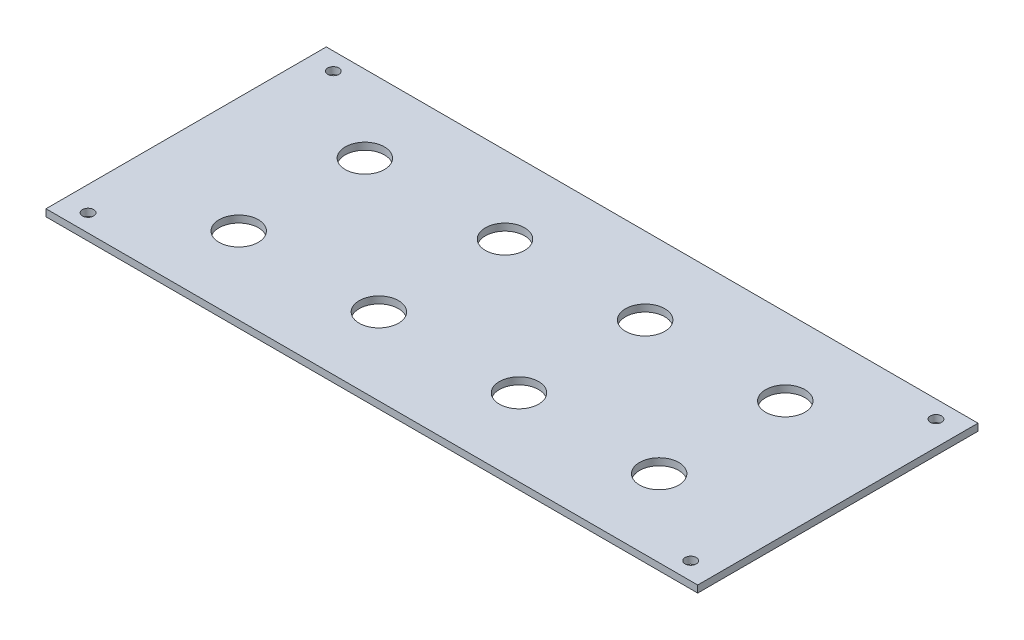
ISO-10303-21;
HEADER;
FILE_DESCRIPTION(('STEP AP214'),'2;1');
FILE_NAME('part.step','',(''),(''),'','','');
FILE_SCHEMA(('AUTOMOTIVE_DESIGN { 1 0 10303 214 1 1 1 1 }'));
ENDSEC;
DATA;
#1=APPLICATION_CONTEXT('core data for automotive mechanical design processes');
#2=APPLICATION_PROTOCOL_DEFINITION('international standard','automotive_design',2000,#1);
#3=PRODUCT_CONTEXT('',#1,'mechanical');
#4=PRODUCT('Part','Part','',(#3));
#5=PRODUCT_RELATED_PRODUCT_CATEGORY('part','',(#4));
#6=PRODUCT_DEFINITION_FORMATION('','',#4);
#7=PRODUCT_DEFINITION_CONTEXT('part definition',#1,'design');
#8=PRODUCT_DEFINITION('design','',#6,#7);
#9=PRODUCT_DEFINITION_SHAPE('','',#8);
#10=(LENGTH_UNIT() NAMED_UNIT(*) SI_UNIT(.MILLI.,.METRE.));
#11=(NAMED_UNIT(*) PLANE_ANGLE_UNIT() SI_UNIT($,.RADIAN.));
#12=(NAMED_UNIT(*) SI_UNIT($,.STERADIAN.) SOLID_ANGLE_UNIT());
#13=UNCERTAINTY_MEASURE_WITH_UNIT(LENGTH_MEASURE(1.E-05),#10,'distance_accuracy_value','');
#14=(GEOMETRIC_REPRESENTATION_CONTEXT(3) GLOBAL_UNCERTAINTY_ASSIGNED_CONTEXT((#13)) GLOBAL_UNIT_ASSIGNED_CONTEXT((#10,
#11,#12)) REPRESENTATION_CONTEXT('',''));
#15=CARTESIAN_POINT('',(0.,0.,0.));
#16=DIRECTION('',(0.,0.,1.));
#17=DIRECTION('',(1.,0.,0.));
#18=AXIS2_PLACEMENT_3D('',#15,#16,#17);
#19=CARTESIAN_POINT('',(0.,0.,80.));
#20=DIRECTION('',(0.,0.,1.));
#21=DIRECTION('',(1.,0.,0.));
#22=AXIS2_PLACEMENT_3D('',#19,#20,#21);
#23=PLANE('',#22);
#24=DIRECTION('',(-1.,0.,0.));
#25=VECTOR('',#24,1.);
#26=CARTESIAN_POINT('',(0.,-1.,80.));
#27=LINE('',#26,#25);
#28=CARTESIAN_POINT('',(93.,-1.,80.));
#29=VERTEX_POINT('',#28);
#30=CARTESIAN_POINT('',(-93.,-1.,80.));
#31=VERTEX_POINT('',#30);
#32=EDGE_CURVE('E10',#29,#31,#27,.T.);
#33=ORIENTED_EDGE('',*,*,#32,.F.);
#34=DIRECTION('',(0.,-1.,0.));
#35=VECTOR('',#34,1.);
#36=CARTESIAN_POINT('',(93.,0.,80.));
#37=LINE('',#36,#35);
#38=CARTESIAN_POINT('',(93.,1.,80.));
#39=VERTEX_POINT('',#38);
#40=EDGE_CURVE('E62',#39,#29,#37,.T.);
#41=ORIENTED_EDGE('',*,*,#40,.F.);
#42=DIRECTION('',(1.,0.,0.));
#43=VECTOR('',#42,1.);
#44=CARTESIAN_POINT('',(0.,1.,80.));
#45=LINE('',#44,#43);
#46=CARTESIAN_POINT('',(-93.,1.,80.));
#47=VERTEX_POINT('',#46);
#48=EDGE_CURVE('E90',#47,#39,#45,.T.);
#49=ORIENTED_EDGE('',*,*,#48,.F.);
#50=DIRECTION('',(0.,1.,0.));
#51=VECTOR('',#50,1.);
#52=CARTESIAN_POINT('',(-93.,0.,80.));
#53=LINE('',#52,#51);
#54=EDGE_CURVE('E24',#31,#47,#53,.T.);
#55=ORIENTED_EDGE('',*,*,#54,.F.);
#56=EDGE_LOOP('',(#33,#41,#49,#55));
#57=FACE_BOUND('',#56,.T.);
#58=ADVANCED_FACE('F16',(#57),#23,.T.);
#59=CARTESIAN_POINT('',(0.,-1.,0.));
#60=DIRECTION('',(0.,-1.,0.));
#61=DIRECTION('',(0.,0.,-1.));
#62=AXIS2_PLACEMENT_3D('',#59,#60,#61);
#63=PLANE('',#62);
#64=CARTESIAN_POINT('',(86.,-1.,75.));
#65=DIRECTION('',(0.,-1.,0.));
#66=DIRECTION('',(0.,0.,-1.));
#67=AXIS2_PLACEMENT_3D('',#64,#65,#66);
#68=CIRCLE('',#67,1.6);
#69=CARTESIAN_POINT('',(86.,-1.,73.4));
#70=VERTEX_POINT('',#69);
#71=EDGE_CURVE('E134',#70,#70,#68,.T.);
#72=ORIENTED_EDGE('',*,*,#71,.F.);
#73=EDGE_LOOP('',(#72));
#74=FACE_BOUND('',#73,.T.);
#75=CARTESIAN_POINT('',(86.,-1.,5.));
#76=DIRECTION('',(0.,-1.,0.));
#77=DIRECTION('',(0.,0.,-1.));
#78=AXIS2_PLACEMENT_3D('',#75,#76,#77);
#79=CIRCLE('',#78,1.6);
#80=CARTESIAN_POINT('',(86.,-1.,3.4));
#81=VERTEX_POINT('',#80);
#82=EDGE_CURVE('E131',#81,#81,#79,.T.);
#83=ORIENTED_EDGE('',*,*,#82,.F.);
#84=EDGE_LOOP('',(#83));
#85=FACE_BOUND('',#84,.T.);
#86=CARTESIAN_POINT('',(-86.,-1.,75.));
#87=DIRECTION('',(0.,-1.,0.));
#88=DIRECTION('',(0.,0.,-1.));
#89=AXIS2_PLACEMENT_3D('',#86,#87,#88);
#90=CIRCLE('',#89,1.6);
#91=CARTESIAN_POINT('',(-86.,-1.,73.4));
#92=VERTEX_POINT('',#91);
#93=EDGE_CURVE('E128',#92,#92,#90,.T.);
#94=ORIENTED_EDGE('',*,*,#93,.F.);
#95=EDGE_LOOP('',(#94));
#96=FACE_BOUND('',#95,.T.);
#97=CARTESIAN_POINT('',(-86.,-1.,5.));
#98=DIRECTION('',(0.,-1.,0.));
#99=DIRECTION('',(0.,0.,-1.));
#100=AXIS2_PLACEMENT_3D('',#97,#98,#99);
#101=CIRCLE('',#100,1.6);
#102=CARTESIAN_POINT('',(-86.,-1.,3.4));
#103=VERTEX_POINT('',#102);
#104=EDGE_CURVE('E124',#103,#103,#101,.T.);
#105=ORIENTED_EDGE('',*,*,#104,.F.);
#106=EDGE_LOOP('',(#105));
#107=FACE_BOUND('',#106,.T.);
#108=CARTESIAN_POINT('',(60.,-1.,58.));
#109=DIRECTION('',(0.,-1.,0.));
#110=DIRECTION('',(0.,0.,-1.));
#111=AXIS2_PLACEMENT_3D('',#108,#109,#110);
#112=CIRCLE('',#111,5.6);
#113=CARTESIAN_POINT('',(60.,-1.,52.4));
#114=VERTEX_POINT('',#113);
#115=EDGE_CURVE('E120',#114,#114,#112,.T.);
#116=ORIENTED_EDGE('',*,*,#115,.F.);
#117=EDGE_LOOP('',(#116));
#118=FACE_BOUND('',#117,.T.);
#119=CARTESIAN_POINT('',(20.,-1.,58.));
#120=DIRECTION('',(0.,-1.,0.));
#121=DIRECTION('',(0.,0.,-1.));
#122=AXIS2_PLACEMENT_3D('',#119,#120,#121);
#123=CIRCLE('',#122,5.6);
#124=CARTESIAN_POINT('',(20.,-1.,52.4));
#125=VERTEX_POINT('',#124);
#126=EDGE_CURVE('E116',#125,#125,#123,.T.);
#127=ORIENTED_EDGE('',*,*,#126,.F.);
#128=EDGE_LOOP('',(#127));
#129=FACE_BOUND('',#128,.T.);
#130=CARTESIAN_POINT('',(-20.,-1.,58.));
#131=DIRECTION('',(0.,-1.,0.));
#132=DIRECTION('',(0.,0.,-1.));
#133=AXIS2_PLACEMENT_3D('',#130,#131,#132);
#134=CIRCLE('',#133,5.6);
#135=CARTESIAN_POINT('',(-20.,-1.,52.4));
#136=VERTEX_POINT('',#135);
#137=EDGE_CURVE('E112',#136,#136,#134,.T.);
#138=ORIENTED_EDGE('',*,*,#137,.F.);
#139=EDGE_LOOP('',(#138));
#140=FACE_BOUND('',#139,.T.);
#141=CARTESIAN_POINT('',(-60.,-1.,58.));
#142=DIRECTION('',(0.,-1.,0.));
#143=DIRECTION('',(0.,0.,-1.));
#144=AXIS2_PLACEMENT_3D('',#141,#142,#143);
#145=CIRCLE('',#144,5.6);
#146=CARTESIAN_POINT('',(-60.,-1.,52.4));
#147=VERTEX_POINT('',#146);
#148=EDGE_CURVE('E108',#147,#147,#145,.T.);
#149=ORIENTED_EDGE('',*,*,#148,.F.);
#150=EDGE_LOOP('',(#149));
#151=FACE_BOUND('',#150,.T.);
#152=CARTESIAN_POINT('',(60.,-1.,22.));
#153=DIRECTION('',(0.,-1.,0.));
#154=DIRECTION('',(0.,0.,-1.));
#155=AXIS2_PLACEMENT_3D('',#152,#153,#154);
#156=CIRCLE('',#155,5.6);
#157=CARTESIAN_POINT('',(60.,-1.,16.4));
#158=VERTEX_POINT('',#157);
#159=EDGE_CURVE('E104',#158,#158,#156,.T.);
#160=ORIENTED_EDGE('',*,*,#159,.F.);
#161=EDGE_LOOP('',(#160));
#162=FACE_BOUND('',#161,.T.);
#163=CARTESIAN_POINT('',(20.,-1.,22.));
#164=DIRECTION('',(0.,-1.,0.));
#165=DIRECTION('',(0.,0.,-1.));
#166=AXIS2_PLACEMENT_3D('',#163,#164,#165);
#167=CIRCLE('',#166,5.6);
#168=CARTESIAN_POINT('',(20.,-1.,16.4));
#169=VERTEX_POINT('',#168);
#170=EDGE_CURVE('E100',#169,#169,#167,.T.);
#171=ORIENTED_EDGE('',*,*,#170,.F.);
#172=EDGE_LOOP('',(#171));
#173=FACE_BOUND('',#172,.T.);
#174=CARTESIAN_POINT('',(-20.,-1.,22.));
#175=DIRECTION('',(0.,-1.,0.));
#176=DIRECTION('',(0.,0.,-1.));
#177=AXIS2_PLACEMENT_3D('',#174,#175,#176);
#178=CIRCLE('',#177,5.6);
#179=CARTESIAN_POINT('',(-20.,-1.,16.4));
#180=VERTEX_POINT('',#179);
#181=EDGE_CURVE('E96',#180,#180,#178,.T.);
#182=ORIENTED_EDGE('',*,*,#181,.F.);
#183=EDGE_LOOP('',(#182));
#184=FACE_BOUND('',#183,.T.);
#185=CARTESIAN_POINT('',(-60.,-1.,22.));
#186=DIRECTION('',(0.,-1.,0.));
#187=DIRECTION('',(0.,0.,-1.));
#188=AXIS2_PLACEMENT_3D('',#185,#186,#187);
#189=CIRCLE('',#188,5.6);
#190=CARTESIAN_POINT('',(-60.,-1.,16.4));
#191=VERTEX_POINT('',#190);
#192=EDGE_CURVE('E73',#191,#191,#189,.T.);
#193=ORIENTED_EDGE('',*,*,#192,.F.);
#194=EDGE_LOOP('',(#193));
#195=FACE_BOUND('',#194,.T.);
#196=DIRECTION('',(0.,0.,1.));
#197=VECTOR('',#196,1.);
#198=CARTESIAN_POINT('',(93.,-1.,0.));
#199=LINE('',#198,#197);
#200=CARTESIAN_POINT('',(93.,-1.,0.));
#201=VERTEX_POINT('',#200);
#202=EDGE_CURVE('E55',#201,#29,#199,.T.);
#203=ORIENTED_EDGE('',*,*,#202,.T.);
#204=ORIENTED_EDGE('',*,*,#32,.T.);
#205=DIRECTION('',(0.,0.,1.));
#206=VECTOR('',#205,1.);
#207=CARTESIAN_POINT('',(-93.,-1.,0.));
#208=LINE('',#207,#206);
#209=CARTESIAN_POINT('',(-93.,-1.,0.));
#210=VERTEX_POINT('',#209);
#211=EDGE_CURVE('E68',#210,#31,#208,.T.);
#212=ORIENTED_EDGE('',*,*,#211,.F.);
#213=DIRECTION('',(1.,0.,0.));
#214=VECTOR('',#213,1.);
#215=CARTESIAN_POINT('',(0.,-1.,0.));
#216=LINE('',#215,#214);
#217=EDGE_CURVE('E66',#210,#201,#216,.T.);
#218=ORIENTED_EDGE('',*,*,#217,.T.);
#219=EDGE_LOOP('',(#203,#204,#212,#218));
#220=FACE_BOUND('',#219,.T.);
#221=ADVANCED_FACE('F67',(#74,#85,#96,#107,#118,#129,#140,#151,#162,#173,#184,#195,#220),#63,.T.);
#222=CARTESIAN_POINT('',(-93.,0.,0.));
#223=DIRECTION('',(-1.,0.,0.));
#224=DIRECTION('',(0.,0.,1.));
#225=AXIS2_PLACEMENT_3D('',#222,#223,#224);
#226=PLANE('',#225);
#227=ORIENTED_EDGE('',*,*,#211,.T.);
#228=ORIENTED_EDGE('',*,*,#54,.T.);
#229=DIRECTION('',(0.,0.,1.));
#230=VECTOR('',#229,1.);
#231=CARTESIAN_POINT('',(-93.,1.,0.));
#232=LINE('',#231,#230);
#233=CARTESIAN_POINT('',(-93.,1.,0.));
#234=VERTEX_POINT('',#233);
#235=EDGE_CURVE('E85',#234,#47,#232,.T.);
#236=ORIENTED_EDGE('',*,*,#235,.F.);
#237=DIRECTION('',(0.,-1.,0.));
#238=VECTOR('',#237,1.);
#239=CARTESIAN_POINT('',(-93.,0.,0.));
#240=LINE('',#239,#238);
#241=EDGE_CURVE('E72',#234,#210,#240,.T.);
#242=ORIENTED_EDGE('',*,*,#241,.T.);
#243=EDGE_LOOP('',(#227,#228,#236,#242));
#244=FACE_BOUND('',#243,.T.);
#245=ADVANCED_FACE('F169',(#244),#226,.T.);
#246=CARTESIAN_POINT('',(0.,1.,0.));
#247=DIRECTION('',(0.,1.,0.));
#248=DIRECTION('',(0.,0.,1.));
#249=AXIS2_PLACEMENT_3D('',#246,#247,#248);
#250=PLANE('',#249);
#251=CARTESIAN_POINT('',(86.,1.,75.));
#252=DIRECTION('',(0.,1.,0.));
#253=DIRECTION('',(0.,0.,1.));
#254=AXIS2_PLACEMENT_3D('',#251,#252,#253);
#255=CIRCLE('',#254,1.6);
#256=CARTESIAN_POINT('',(86.,1.,76.6));
#257=VERTEX_POINT('',#256);
#258=EDGE_CURVE('E19',#257,#257,#255,.T.);
#259=ORIENTED_EDGE('',*,*,#258,.F.);
#260=EDGE_LOOP('',(#259));
#261=FACE_BOUND('',#260,.T.);
#262=CARTESIAN_POINT('',(86.,1.,5.));
#263=DIRECTION('',(0.,1.,0.));
#264=DIRECTION('',(0.,0.,1.));
#265=AXIS2_PLACEMENT_3D('',#262,#263,#264);
#266=CIRCLE('',#265,1.6);
#267=CARTESIAN_POINT('',(86.,1.,6.6));
#268=VERTEX_POINT('',#267);
#269=EDGE_CURVE('E132',#268,#268,#266,.T.);
#270=ORIENTED_EDGE('',*,*,#269,.F.);
#271=EDGE_LOOP('',(#270));
#272=FACE_BOUND('',#271,.T.);
#273=CARTESIAN_POINT('',(-86.,1.,75.));
#274=DIRECTION('',(0.,1.,0.));
#275=DIRECTION('',(0.,0.,1.));
#276=AXIS2_PLACEMENT_3D('',#273,#274,#275);
#277=CIRCLE('',#276,1.6);
#278=CARTESIAN_POINT('',(-86.,1.,76.6));
#279=VERTEX_POINT('',#278);
#280=EDGE_CURVE('E129',#279,#279,#277,.T.);
#281=ORIENTED_EDGE('',*,*,#280,.F.);
#282=EDGE_LOOP('',(#281));
#283=FACE_BOUND('',#282,.T.);
#284=CARTESIAN_POINT('',(-86.,1.,5.));
#285=DIRECTION('',(0.,1.,0.));
#286=DIRECTION('',(0.,0.,1.));
#287=AXIS2_PLACEMENT_3D('',#284,#285,#286);
#288=CIRCLE('',#287,1.6);
#289=CARTESIAN_POINT('',(-86.,1.,6.6));
#290=VERTEX_POINT('',#289);
#291=EDGE_CURVE('E125',#290,#290,#288,.T.);
#292=ORIENTED_EDGE('',*,*,#291,.F.);
#293=EDGE_LOOP('',(#292));
#294=FACE_BOUND('',#293,.T.);
#295=CARTESIAN_POINT('',(60.,1.,58.));
#296=DIRECTION('',(0.,1.,0.));
#297=DIRECTION('',(0.,0.,1.));
#298=AXIS2_PLACEMENT_3D('',#295,#296,#297);
#299=CIRCLE('',#298,5.6);
#300=CARTESIAN_POINT('',(60.,1.,63.6));
#301=VERTEX_POINT('',#300);
#302=EDGE_CURVE('E121',#301,#301,#299,.T.);
#303=ORIENTED_EDGE('',*,*,#302,.F.);
#304=EDGE_LOOP('',(#303));
#305=FACE_BOUND('',#304,.T.);
#306=CARTESIAN_POINT('',(20.,1.,58.));
#307=DIRECTION('',(0.,1.,0.));
#308=DIRECTION('',(0.,0.,1.));
#309=AXIS2_PLACEMENT_3D('',#306,#307,#308);
#310=CIRCLE('',#309,5.6);
#311=CARTESIAN_POINT('',(20.,1.,63.6));
#312=VERTEX_POINT('',#311);
#313=EDGE_CURVE('E117',#312,#312,#310,.T.);
#314=ORIENTED_EDGE('',*,*,#313,.F.);
#315=EDGE_LOOP('',(#314));
#316=FACE_BOUND('',#315,.T.);
#317=CARTESIAN_POINT('',(-20.,1.,58.));
#318=DIRECTION('',(0.,1.,0.));
#319=DIRECTION('',(0.,0.,1.));
#320=AXIS2_PLACEMENT_3D('',#317,#318,#319);
#321=CIRCLE('',#320,5.6);
#322=CARTESIAN_POINT('',(-20.,1.,63.6));
#323=VERTEX_POINT('',#322);
#324=EDGE_CURVE('E113',#323,#323,#321,.T.);
#325=ORIENTED_EDGE('',*,*,#324,.F.);
#326=EDGE_LOOP('',(#325));
#327=FACE_BOUND('',#326,.T.);
#328=CARTESIAN_POINT('',(-60.,1.,58.));
#329=DIRECTION('',(0.,1.,0.));
#330=DIRECTION('',(0.,0.,1.));
#331=AXIS2_PLACEMENT_3D('',#328,#329,#330);
#332=CIRCLE('',#331,5.6);
#333=CARTESIAN_POINT('',(-60.,1.,63.6));
#334=VERTEX_POINT('',#333);
#335=EDGE_CURVE('E109',#334,#334,#332,.T.);
#336=ORIENTED_EDGE('',*,*,#335,.F.);
#337=EDGE_LOOP('',(#336));
#338=FACE_BOUND('',#337,.T.);
#339=CARTESIAN_POINT('',(60.,1.,22.));
#340=DIRECTION('',(0.,1.,0.));
#341=DIRECTION('',(0.,0.,1.));
#342=AXIS2_PLACEMENT_3D('',#339,#340,#341);
#343=CIRCLE('',#342,5.6);
#344=CARTESIAN_POINT('',(60.,1.,27.6));
#345=VERTEX_POINT('',#344);
#346=EDGE_CURVE('E105',#345,#345,#343,.T.);
#347=ORIENTED_EDGE('',*,*,#346,.F.);
#348=EDGE_LOOP('',(#347));
#349=FACE_BOUND('',#348,.T.);
#350=CARTESIAN_POINT('',(20.,1.,22.));
#351=DIRECTION('',(0.,1.,0.));
#352=DIRECTION('',(0.,0.,1.));
#353=AXIS2_PLACEMENT_3D('',#350,#351,#352);
#354=CIRCLE('',#353,5.6);
#355=CARTESIAN_POINT('',(20.,1.,27.6));
#356=VERTEX_POINT('',#355);
#357=EDGE_CURVE('E101',#356,#356,#354,.T.);
#358=ORIENTED_EDGE('',*,*,#357,.F.);
#359=EDGE_LOOP('',(#358));
#360=FACE_BOUND('',#359,.T.);
#361=CARTESIAN_POINT('',(-20.,1.,22.));
#362=DIRECTION('',(0.,1.,0.));
#363=DIRECTION('',(0.,0.,1.));
#364=AXIS2_PLACEMENT_3D('',#361,#362,#363);
#365=CIRCLE('',#364,5.6);
#366=CARTESIAN_POINT('',(-20.,1.,27.6));
#367=VERTEX_POINT('',#366);
#368=EDGE_CURVE('E97',#367,#367,#365,.T.);
#369=ORIENTED_EDGE('',*,*,#368,.F.);
#370=EDGE_LOOP('',(#369));
#371=FACE_BOUND('',#370,.T.);
#372=CARTESIAN_POINT('',(-60.,1.,22.));
#373=DIRECTION('',(0.,1.,0.));
#374=DIRECTION('',(0.,0.,1.));
#375=AXIS2_PLACEMENT_3D('',#372,#373,#374);
#376=CIRCLE('',#375,5.6);
#377=CARTESIAN_POINT('',(-60.,1.,27.6));
#378=VERTEX_POINT('',#377);
#379=EDGE_CURVE('E93',#378,#378,#376,.T.);
#380=ORIENTED_EDGE('',*,*,#379,.F.);
#381=EDGE_LOOP('',(#380));
#382=FACE_BOUND('',#381,.T.);
#383=ORIENTED_EDGE('',*,*,#235,.T.);
#384=ORIENTED_EDGE('',*,*,#48,.T.);
#385=DIRECTION('',(0.,0.,1.));
#386=VECTOR('',#385,1.);
#387=CARTESIAN_POINT('',(93.,1.,0.));
#388=LINE('',#387,#386);
#389=CARTESIAN_POINT('',(93.,1.,0.));
#390=VERTEX_POINT('',#389);
#391=EDGE_CURVE('E63',#390,#39,#388,.T.);
#392=ORIENTED_EDGE('',*,*,#391,.F.);
#393=DIRECTION('',(-1.,0.,0.));
#394=VECTOR('',#393,1.);
#395=CARTESIAN_POINT('',(0.,1.,0.));
#396=LINE('',#395,#394);
#397=EDGE_CURVE('E78',#390,#234,#396,.T.);
#398=ORIENTED_EDGE('',*,*,#397,.T.);
#399=EDGE_LOOP('',(#383,#384,#392,#398));
#400=FACE_BOUND('',#399,.T.);
#401=ADVANCED_FACE('F176',(#261,#272,#283,#294,#305,#316,#327,#338,#349,#360,#371,#382,#400),
#250,.T.);
#402=CARTESIAN_POINT('',(0.,0.,0.));
#403=DIRECTION('',(0.,0.,-1.));
#404=DIRECTION('',(-1.,0.,0.));
#405=AXIS2_PLACEMENT_3D('',#402,#403,#404);
#406=PLANE('',#405);
#407=DIRECTION('',(0.,1.,0.));
#408=VECTOR('',#407,1.);
#409=CARTESIAN_POINT('',(93.,0.,0.));
#410=LINE('',#409,#408);
#411=EDGE_CURVE('E60',#201,#390,#410,.T.);
#412=ORIENTED_EDGE('',*,*,#411,.F.);
#413=ORIENTED_EDGE('',*,*,#217,.F.);
#414=ORIENTED_EDGE('',*,*,#241,.F.);
#415=ORIENTED_EDGE('',*,*,#397,.F.);
#416=EDGE_LOOP('',(#412,#413,#414,#415));
#417=FACE_BOUND('',#416,.T.);
#418=ADVANCED_FACE('F76',(#417),#406,.T.);
#419=CARTESIAN_POINT('',(93.,0.,0.));
#420=DIRECTION('',(1.,0.,0.));
#421=DIRECTION('',(0.,0.,-1.));
#422=AXIS2_PLACEMENT_3D('',#419,#420,#421);
#423=PLANE('',#422);
#424=ORIENTED_EDGE('',*,*,#411,.T.);
#425=ORIENTED_EDGE('',*,*,#391,.T.);
#426=ORIENTED_EDGE('',*,*,#40,.T.);
#427=ORIENTED_EDGE('',*,*,#202,.F.);
#428=EDGE_LOOP('',(#424,#425,#426,#427));
#429=FACE_BOUND('',#428,.T.);
#430=ADVANCED_FACE('F57',(#429),#423,.T.);
#431=CARTESIAN_POINT('',(-60.,-1.4,22.));
#432=DIRECTION('',(0.,1.,0.));
#433=DIRECTION('',(0.,0.,1.));
#434=AXIS2_PLACEMENT_3D('',#431,#432,#433);
#435=CYLINDRICAL_SURFACE('',#434,5.6);
#436=ORIENTED_EDGE('',*,*,#192,.T.);
#437=EDGE_LOOP('',(#436));
#438=FACE_BOUND('',#437,.T.);
#439=ORIENTED_EDGE('',*,*,#379,.T.);
#440=EDGE_LOOP('',(#439));
#441=FACE_BOUND('',#440,.T.);
#442=ADVANCED_FACE('F165',(#438,#441),#435,.F.);
#443=CARTESIAN_POINT('',(-20.,-1.4,22.));
#444=DIRECTION('',(0.,1.,0.));
#445=DIRECTION('',(0.,0.,1.));
#446=AXIS2_PLACEMENT_3D('',#443,#444,#445);
#447=CYLINDRICAL_SURFACE('',#446,5.6);
#448=ORIENTED_EDGE('',*,*,#181,.T.);
#449=EDGE_LOOP('',(#448));
#450=FACE_BOUND('',#449,.T.);
#451=ORIENTED_EDGE('',*,*,#368,.T.);
#452=EDGE_LOOP('',(#451));
#453=FACE_BOUND('',#452,.T.);
#454=ADVANCED_FACE('F190',(#450,#453),#447,.F.);
#455=CARTESIAN_POINT('',(20.,-1.4,22.));
#456=DIRECTION('',(0.,1.,0.));
#457=DIRECTION('',(0.,0.,1.));
#458=AXIS2_PLACEMENT_3D('',#455,#456,#457);
#459=CYLINDRICAL_SURFACE('',#458,5.6);
#460=ORIENTED_EDGE('',*,*,#170,.T.);
#461=EDGE_LOOP('',(#460));
#462=FACE_BOUND('',#461,.T.);
#463=ORIENTED_EDGE('',*,*,#357,.T.);
#464=EDGE_LOOP('',(#463));
#465=FACE_BOUND('',#464,.T.);
#466=ADVANCED_FACE('F193',(#462,#465),#459,.F.);
#467=CARTESIAN_POINT('',(60.,-1.4,22.));
#468=DIRECTION('',(0.,1.,0.));
#469=DIRECTION('',(0.,0.,1.));
#470=AXIS2_PLACEMENT_3D('',#467,#468,#469);
#471=CYLINDRICAL_SURFACE('',#470,5.6);
#472=ORIENTED_EDGE('',*,*,#159,.T.);
#473=EDGE_LOOP('',(#472));
#474=FACE_BOUND('',#473,.T.);
#475=ORIENTED_EDGE('',*,*,#346,.T.);
#476=EDGE_LOOP('',(#475));
#477=FACE_BOUND('',#476,.T.);
#478=ADVANCED_FACE('F197',(#474,#477),#471,.F.);
#479=CARTESIAN_POINT('',(-60.,-1.4,58.));
#480=DIRECTION('',(0.,1.,0.));
#481=DIRECTION('',(0.,0.,1.));
#482=AXIS2_PLACEMENT_3D('',#479,#480,#481);
#483=CYLINDRICAL_SURFACE('',#482,5.6);
#484=ORIENTED_EDGE('',*,*,#148,.T.);
#485=EDGE_LOOP('',(#484));
#486=FACE_BOUND('',#485,.T.);
#487=ORIENTED_EDGE('',*,*,#335,.T.);
#488=EDGE_LOOP('',(#487));
#489=FACE_BOUND('',#488,.T.);
#490=ADVANCED_FACE('F201',(#486,#489),#483,.F.);
#491=CARTESIAN_POINT('',(-20.,-1.4,58.));
#492=DIRECTION('',(0.,1.,0.));
#493=DIRECTION('',(0.,0.,1.));
#494=AXIS2_PLACEMENT_3D('',#491,#492,#493);
#495=CYLINDRICAL_SURFACE('',#494,5.6);
#496=ORIENTED_EDGE('',*,*,#137,.T.);
#497=EDGE_LOOP('',(#496));
#498=FACE_BOUND('',#497,.T.);
#499=ORIENTED_EDGE('',*,*,#324,.T.);
#500=EDGE_LOOP('',(#499));
#501=FACE_BOUND('',#500,.T.);
#502=ADVANCED_FACE('F205',(#498,#501),#495,.F.);
#503=CARTESIAN_POINT('',(20.,-1.4,58.));
#504=DIRECTION('',(0.,1.,0.));
#505=DIRECTION('',(0.,0.,1.));
#506=AXIS2_PLACEMENT_3D('',#503,#504,#505);
#507=CYLINDRICAL_SURFACE('',#506,5.6);
#508=ORIENTED_EDGE('',*,*,#126,.T.);
#509=EDGE_LOOP('',(#508));
#510=FACE_BOUND('',#509,.T.);
#511=ORIENTED_EDGE('',*,*,#313,.T.);
#512=EDGE_LOOP('',(#511));
#513=FACE_BOUND('',#512,.T.);
#514=ADVANCED_FACE('F209',(#510,#513),#507,.F.);
#515=CARTESIAN_POINT('',(60.,-1.4,58.));
#516=DIRECTION('',(0.,1.,0.));
#517=DIRECTION('',(0.,0.,1.));
#518=AXIS2_PLACEMENT_3D('',#515,#516,#517);
#519=CYLINDRICAL_SURFACE('',#518,5.6);
#520=ORIENTED_EDGE('',*,*,#115,.T.);
#521=EDGE_LOOP('',(#520));
#522=FACE_BOUND('',#521,.T.);
#523=ORIENTED_EDGE('',*,*,#302,.T.);
#524=EDGE_LOOP('',(#523));
#525=FACE_BOUND('',#524,.T.);
#526=ADVANCED_FACE('F213',(#522,#525),#519,.F.);
#527=CARTESIAN_POINT('',(-86.,-1.4,5.));
#528=DIRECTION('',(0.,1.,0.));
#529=DIRECTION('',(0.,0.,1.));
#530=AXIS2_PLACEMENT_3D('',#527,#528,#529);
#531=CYLINDRICAL_SURFACE('',#530,1.6);
#532=ORIENTED_EDGE('',*,*,#104,.T.);
#533=EDGE_LOOP('',(#532));
#534=FACE_BOUND('',#533,.T.);
#535=ORIENTED_EDGE('',*,*,#291,.T.);
#536=EDGE_LOOP('',(#535));
#537=FACE_BOUND('',#536,.T.);
#538=ADVANCED_FACE('F217',(#534,#537),#531,.F.);
#539=CARTESIAN_POINT('',(-86.,-1.4,75.));
#540=DIRECTION('',(0.,1.,0.));
#541=DIRECTION('',(0.,0.,1.));
#542=AXIS2_PLACEMENT_3D('',#539,#540,#541);
#543=CYLINDRICAL_SURFACE('',#542,1.6);
#544=ORIENTED_EDGE('',*,*,#93,.T.);
#545=EDGE_LOOP('',(#544));
#546=FACE_BOUND('',#545,.T.);
#547=ORIENTED_EDGE('',*,*,#280,.T.);
#548=EDGE_LOOP('',(#547));
#549=FACE_BOUND('',#548,.T.);
#550=ADVANCED_FACE('F221',(#546,#549),#543,.F.);
#551=CARTESIAN_POINT('',(86.,-1.4,5.));
#552=DIRECTION('',(0.,1.,0.));
#553=DIRECTION('',(0.,0.,1.));
#554=AXIS2_PLACEMENT_3D('',#551,#552,#553);
#555=CYLINDRICAL_SURFACE('',#554,1.6);
#556=ORIENTED_EDGE('',*,*,#82,.T.);
#557=EDGE_LOOP('',(#556));
#558=FACE_BOUND('',#557,.T.);
#559=ORIENTED_EDGE('',*,*,#269,.T.);
#560=EDGE_LOOP('',(#559));
#561=FACE_BOUND('',#560,.T.);
#562=ADVANCED_FACE('F225',(#558,#561),#555,.F.);
#563=CARTESIAN_POINT('',(86.,-1.4,75.));
#564=DIRECTION('',(0.,1.,0.));
#565=DIRECTION('',(0.,0.,1.));
#566=AXIS2_PLACEMENT_3D('',#563,#564,#565);
#567=CYLINDRICAL_SURFACE('',#566,1.6);
#568=ORIENTED_EDGE('',*,*,#71,.T.);
#569=EDGE_LOOP('',(#568));
#570=FACE_BOUND('',#569,.T.);
#571=ORIENTED_EDGE('',*,*,#258,.T.);
#572=EDGE_LOOP('',(#571));
#573=FACE_BOUND('',#572,.T.);
#574=ADVANCED_FACE('F229',(#570,#573),#567,.F.);
#575=CLOSED_SHELL('',(#58,#221,#245,#401,#418,#430,#442,#454,#466,#478,#490,#502,#514,#526,#538,
#550,#562,#574));
#576=MANIFOLD_SOLID_BREP('B1',#575);
#577=ADVANCED_BREP_SHAPE_REPRESENTATION('',(#18,#576),#14);
#578=SHAPE_DEFINITION_REPRESENTATION(#9,#577);
ENDSEC;
END-ISO-10303-21;
